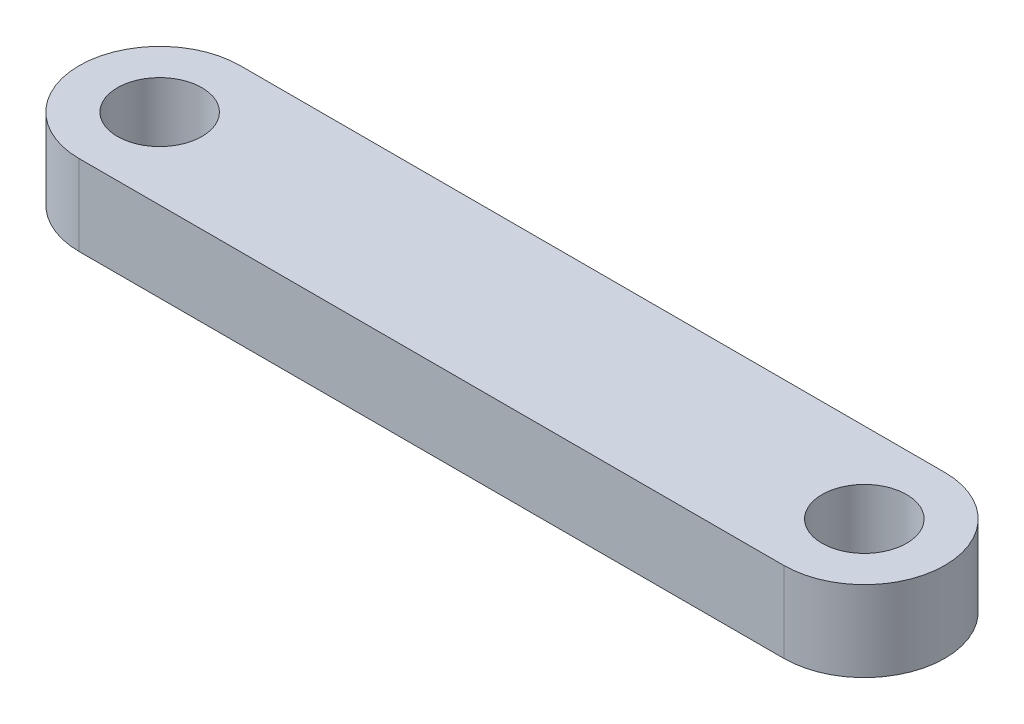
ISO-10303-21;
HEADER;
FILE_DESCRIPTION(('STEP AP214'),'2;1');
FILE_NAME('part.step','',(''),(''),'','','');
FILE_SCHEMA(('AUTOMOTIVE_DESIGN { 1 0 10303 214 1 1 1 1 }'));
ENDSEC;
DATA;
#1=APPLICATION_CONTEXT('core data for automotive mechanical design processes');
#2=APPLICATION_PROTOCOL_DEFINITION('international standard','automotive_design',2000,#1);
#3=PRODUCT_CONTEXT('',#1,'mechanical');
#4=PRODUCT('Part','Part','',(#3));
#5=PRODUCT_RELATED_PRODUCT_CATEGORY('part','',(#4));
#6=PRODUCT_DEFINITION_FORMATION('','',#4);
#7=PRODUCT_DEFINITION_CONTEXT('part definition',#1,'design');
#8=PRODUCT_DEFINITION('design','',#6,#7);
#9=PRODUCT_DEFINITION_SHAPE('','',#8);
#10=(LENGTH_UNIT() NAMED_UNIT(*) SI_UNIT(.MILLI.,.METRE.));
#11=(NAMED_UNIT(*) PLANE_ANGLE_UNIT() SI_UNIT($,.RADIAN.));
#12=(NAMED_UNIT(*) SI_UNIT($,.STERADIAN.) SOLID_ANGLE_UNIT());
#13=UNCERTAINTY_MEASURE_WITH_UNIT(LENGTH_MEASURE(1.E-05),#10,'distance_accuracy_value','');
#14=(GEOMETRIC_REPRESENTATION_CONTEXT(3) GLOBAL_UNCERTAINTY_ASSIGNED_CONTEXT((#13)) GLOBAL_UNIT_ASSIGNED_CONTEXT((#10,
#11,#12)) REPRESENTATION_CONTEXT('',''));
#15=CARTESIAN_POINT('',(0.,0.,0.));
#16=DIRECTION('',(0.,0.,1.));
#17=DIRECTION('',(1.,0.,0.));
#18=AXIS2_PLACEMENT_3D('',#15,#16,#17);
#19=CARTESIAN_POINT('',(0.,2.,0.));
#20=DIRECTION('',(0.,1.,0.));
#21=DIRECTION('',(0.,0.,1.));
#22=AXIS2_PLACEMENT_3D('',#19,#20,#21);
#23=PLANE('',#22);
#24=CARTESIAN_POINT('',(0.,2.,0.));
#25=DIRECTION('',(0.,1.,0.));
#26=DIRECTION('',(0.,0.,1.));
#27=AXIS2_PLACEMENT_3D('',#24,#25,#26);
#28=CIRCLE('',#27,1.05);
#29=CARTESIAN_POINT('',(0.,2.,1.05));
#30=VERTEX_POINT('',#29);
#31=EDGE_CURVE('E116',#30,#30,#28,.T.);
#32=ORIENTED_EDGE('',*,*,#31,.F.);
#33=EDGE_LOOP('',(#32));
#34=FACE_BOUND('',#33,.T.);
#35=CARTESIAN_POINT('',(0.,2.,0.));
#36=DIRECTION('',(0.,1.,0.));
#37=DIRECTION('',(0.,0.,1.));
#38=AXIS2_PLACEMENT_3D('',#35,#36,#37);
#39=CIRCLE('',#38,2.);
#40=CARTESIAN_POINT('',(0.,2.,-2.));
#41=VERTEX_POINT('',#40);
#42=CARTESIAN_POINT('',(0.,2.,2.));
#43=VERTEX_POINT('',#42);
#44=EDGE_CURVE('E96',#41,#43,#39,.T.);
#45=ORIENTED_EDGE('',*,*,#44,.T.);
#46=DIRECTION('',(1.,0.,0.));
#47=VECTOR('',#46,1.);
#48=CARTESIAN_POINT('',(0.,2.,2.));
#49=LINE('',#48,#47);
#50=CARTESIAN_POINT('',(17.5,2.,2.));
#51=VERTEX_POINT('',#50);
#52=EDGE_CURVE('E91',#43,#51,#49,.T.);
#53=ORIENTED_EDGE('',*,*,#52,.T.);
#54=CARTESIAN_POINT('',(17.5,2.,0.));
#55=DIRECTION('',(0.,1.,0.));
#56=DIRECTION('',(0.,0.,1.));
#57=AXIS2_PLACEMENT_3D('',#54,#55,#56);
#58=CIRCLE('',#57,2.);
#59=CARTESIAN_POINT('',(17.5,2.,-2.));
#60=VERTEX_POINT('',#59);
#61=EDGE_CURVE('E94',#51,#60,#58,.T.);
#62=ORIENTED_EDGE('',*,*,#61,.T.);
#63=DIRECTION('',(-1.,0.,0.));
#64=VECTOR('',#63,1.);
#65=CARTESIAN_POINT('',(0.,2.,-2.));
#66=LINE('',#65,#64);
#67=EDGE_CURVE('E61',#60,#41,#66,.T.);
#68=ORIENTED_EDGE('',*,*,#67,.T.);
#69=EDGE_LOOP('',(#45,#53,#62,#68));
#70=FACE_BOUND('',#69,.T.);
#71=CARTESIAN_POINT('',(17.5,2.,0.));
#72=DIRECTION('',(0.,1.,0.));
#73=DIRECTION('',(0.,0.,1.));
#74=AXIS2_PLACEMENT_3D('',#71,#72,#73);
#75=CIRCLE('',#74,1.04999999999999);
#76=CARTESIAN_POINT('',(17.5,2.,1.04999999999999));
#77=VERTEX_POINT('',#76);
#78=EDGE_CURVE('E138',#77,#77,#75,.T.);
#79=ORIENTED_EDGE('',*,*,#78,.F.);
#80=EDGE_LOOP('',(#79));
#81=FACE_BOUND('',#80,.T.);
#82=ADVANCED_FACE('F43',(#34,#70,#81),#23,.T.);
#83=CARTESIAN_POINT('',(0.,0.,0.));
#84=DIRECTION('',(0.,1.,0.));
#85=DIRECTION('',(0.,0.,1.));
#86=AXIS2_PLACEMENT_3D('',#83,#84,#85);
#87=PLANE('',#86);
#88=CARTESIAN_POINT('',(0.,0.,0.));
#89=DIRECTION('',(0.,1.,0.));
#90=DIRECTION('',(0.,0.,1.));
#91=AXIS2_PLACEMENT_3D('',#88,#89,#90);
#92=CIRCLE('',#91,2.);
#93=CARTESIAN_POINT('',(0.,0.,-2.));
#94=VERTEX_POINT('',#93);
#95=CARTESIAN_POINT('',(0.,0.,2.));
#96=VERTEX_POINT('',#95);
#97=EDGE_CURVE('E112',#94,#96,#92,.T.);
#98=ORIENTED_EDGE('',*,*,#97,.F.);
#99=DIRECTION('',(-1.,0.,0.));
#100=VECTOR('',#99,1.);
#101=CARTESIAN_POINT('',(0.,0.,-2.));
#102=LINE('',#101,#100);
#103=CARTESIAN_POINT('',(17.5,0.,-2.));
#104=VERTEX_POINT('',#103);
#105=EDGE_CURVE('E84',#104,#94,#102,.T.);
#106=ORIENTED_EDGE('',*,*,#105,.F.);
#107=CARTESIAN_POINT('',(17.5,0.,0.));
#108=DIRECTION('',(0.,1.,0.));
#109=DIRECTION('',(0.,0.,1.));
#110=AXIS2_PLACEMENT_3D('',#107,#108,#109);
#111=CIRCLE('',#110,2.);
#112=CARTESIAN_POINT('',(17.5,0.,2.));
#113=VERTEX_POINT('',#112);
#114=EDGE_CURVE('E78',#113,#104,#111,.T.);
#115=ORIENTED_EDGE('',*,*,#114,.F.);
#116=DIRECTION('',(1.,0.,0.));
#117=VECTOR('',#116,1.);
#118=CARTESIAN_POINT('',(0.,0.,2.));
#119=LINE('',#118,#117);
#120=EDGE_CURVE('E101',#96,#113,#119,.T.);
#121=ORIENTED_EDGE('',*,*,#120,.F.);
#122=EDGE_LOOP('',(#98,#106,#115,#121));
#123=FACE_BOUND('',#122,.T.);
#124=CARTESIAN_POINT('',(0.,0.,0.));
#125=DIRECTION('',(0.,1.,0.));
#126=DIRECTION('',(0.,0.,1.));
#127=AXIS2_PLACEMENT_3D('',#124,#125,#126);
#128=CIRCLE('',#127,1.05);
#129=CARTESIAN_POINT('',(0.,0.,1.05));
#130=VERTEX_POINT('',#129);
#131=EDGE_CURVE('E134',#130,#130,#128,.T.);
#132=ORIENTED_EDGE('',*,*,#131,.T.);
#133=EDGE_LOOP('',(#132));
#134=FACE_BOUND('',#133,.T.);
#135=CARTESIAN_POINT('',(17.5,0.,0.));
#136=DIRECTION('',(0.,1.,0.));
#137=DIRECTION('',(0.,0.,1.));
#138=AXIS2_PLACEMENT_3D('',#135,#136,#137);
#139=CIRCLE('',#138,1.04999999999999);
#140=CARTESIAN_POINT('',(17.5,0.,1.04999999999999));
#141=VERTEX_POINT('',#140);
#142=EDGE_CURVE('E142',#141,#141,#139,.T.);
#143=ORIENTED_EDGE('',*,*,#142,.T.);
#144=EDGE_LOOP('',(#143));
#145=FACE_BOUND('',#144,.T.);
#146=ADVANCED_FACE('F129',(#123,#134,#145),#87,.F.);
#147=CARTESIAN_POINT('',(0.,2.,0.));
#148=DIRECTION('',(0.,-1.,0.));
#149=DIRECTION('',(0.,0.,-1.));
#150=AXIS2_PLACEMENT_3D('',#147,#148,#149);
#151=CYLINDRICAL_SURFACE('',#150,2.);
#152=ORIENTED_EDGE('',*,*,#97,.T.);
#153=DIRECTION('',(0.,-1.,0.));
#154=VECTOR('',#153,1.);
#155=CARTESIAN_POINT('',(0.,2.,2.));
#156=LINE('',#155,#154);
#157=EDGE_CURVE('E11',#43,#96,#156,.T.);
#158=ORIENTED_EDGE('',*,*,#157,.F.);
#159=ORIENTED_EDGE('',*,*,#44,.F.);
#160=DIRECTION('',(0.,-1.,0.));
#161=VECTOR('',#160,1.);
#162=CARTESIAN_POINT('',(0.,2.,-2.));
#163=LINE('',#162,#161);
#164=EDGE_CURVE('E108',#41,#94,#163,.T.);
#165=ORIENTED_EDGE('',*,*,#164,.T.);
#166=EDGE_LOOP('',(#152,#158,#159,#165));
#167=FACE_BOUND('',#166,.T.);
#168=ADVANCED_FACE('F45',(#167),#151,.T.);
#169=CARTESIAN_POINT('',(0.,2.,2.));
#170=DIRECTION('',(0.,0.,-1.));
#171=DIRECTION('',(-1.,0.,0.));
#172=AXIS2_PLACEMENT_3D('',#169,#170,#171);
#173=PLANE('',#172);
#174=ORIENTED_EDGE('',*,*,#120,.T.);
#175=DIRECTION('',(0.,-1.,0.));
#176=VECTOR('',#175,1.);
#177=CARTESIAN_POINT('',(17.5,2.,2.));
#178=LINE('',#177,#176);
#179=EDGE_CURVE('E53',#51,#113,#178,.T.);
#180=ORIENTED_EDGE('',*,*,#179,.F.);
#181=ORIENTED_EDGE('',*,*,#52,.F.);
#182=ORIENTED_EDGE('',*,*,#157,.T.);
#183=EDGE_LOOP('',(#174,#180,#181,#182));
#184=FACE_BOUND('',#183,.T.);
#185=ADVANCED_FACE('F100',(#184),#173,.F.);
#186=CARTESIAN_POINT('',(17.5,2.,0.));
#187=DIRECTION('',(0.,-1.,0.));
#188=DIRECTION('',(0.,0.,-1.));
#189=AXIS2_PLACEMENT_3D('',#186,#187,#188);
#190=CYLINDRICAL_SURFACE('',#189,2.);
#191=ORIENTED_EDGE('',*,*,#114,.T.);
#192=DIRECTION('',(0.,-1.,0.));
#193=VECTOR('',#192,1.);
#194=CARTESIAN_POINT('',(17.5,2.,-2.));
#195=LINE('',#194,#193);
#196=EDGE_CURVE('E103',#60,#104,#195,.T.);
#197=ORIENTED_EDGE('',*,*,#196,.F.);
#198=ORIENTED_EDGE('',*,*,#61,.F.);
#199=ORIENTED_EDGE('',*,*,#179,.T.);
#200=EDGE_LOOP('',(#191,#197,#198,#199));
#201=FACE_BOUND('',#200,.T.);
#202=ADVANCED_FACE('F104',(#201),#190,.T.);
#203=CARTESIAN_POINT('',(0.,2.,-2.));
#204=DIRECTION('',(0.,0.,1.));
#205=DIRECTION('',(1.,0.,0.));
#206=AXIS2_PLACEMENT_3D('',#203,#204,#205);
#207=PLANE('',#206);
#208=ORIENTED_EDGE('',*,*,#105,.T.);
#209=ORIENTED_EDGE('',*,*,#164,.F.);
#210=ORIENTED_EDGE('',*,*,#67,.F.);
#211=ORIENTED_EDGE('',*,*,#196,.T.);
#212=EDGE_LOOP('',(#208,#209,#210,#211));
#213=FACE_BOUND('',#212,.T.);
#214=ADVANCED_FACE('F126',(#213),#207,.F.);
#215=CARTESIAN_POINT('',(0.,2.,0.));
#216=DIRECTION('',(0.,-1.,0.));
#217=DIRECTION('',(0.,0.,-1.));
#218=AXIS2_PLACEMENT_3D('',#215,#216,#217);
#219=CYLINDRICAL_SURFACE('',#218,1.05);
#220=ORIENTED_EDGE('',*,*,#31,.T.);
#221=EDGE_LOOP('',(#220));
#222=FACE_BOUND('',#221,.T.);
#223=ORIENTED_EDGE('',*,*,#131,.F.);
#224=EDGE_LOOP('',(#223));
#225=FACE_BOUND('',#224,.T.);
#226=ADVANCED_FACE('F161',(#222,#225),#219,.F.);
#227=CARTESIAN_POINT('',(17.5,2.,0.));
#228=DIRECTION('',(0.,-1.,0.));
#229=DIRECTION('',(0.,0.,-1.));
#230=AXIS2_PLACEMENT_3D('',#227,#228,#229);
#231=CYLINDRICAL_SURFACE('',#230,1.04999999999999);
#232=ORIENTED_EDGE('',*,*,#78,.T.);
#233=EDGE_LOOP('',(#232));
#234=FACE_BOUND('',#233,.T.);
#235=ORIENTED_EDGE('',*,*,#142,.F.);
#236=EDGE_LOOP('',(#235));
#237=FACE_BOUND('',#236,.T.);
#238=ADVANCED_FACE('F150',(#234,#237),#231,.F.);
#239=CLOSED_SHELL('',(#82,#146,#168,#185,#202,#214,#226,#238));
#240=MANIFOLD_SOLID_BREP('B2',#239);
#241=ADVANCED_BREP_SHAPE_REPRESENTATION('',(#18,#240),#14);
#242=SHAPE_DEFINITION_REPRESENTATION(#9,#241);
ENDSEC;
END-ISO-10303-21;
